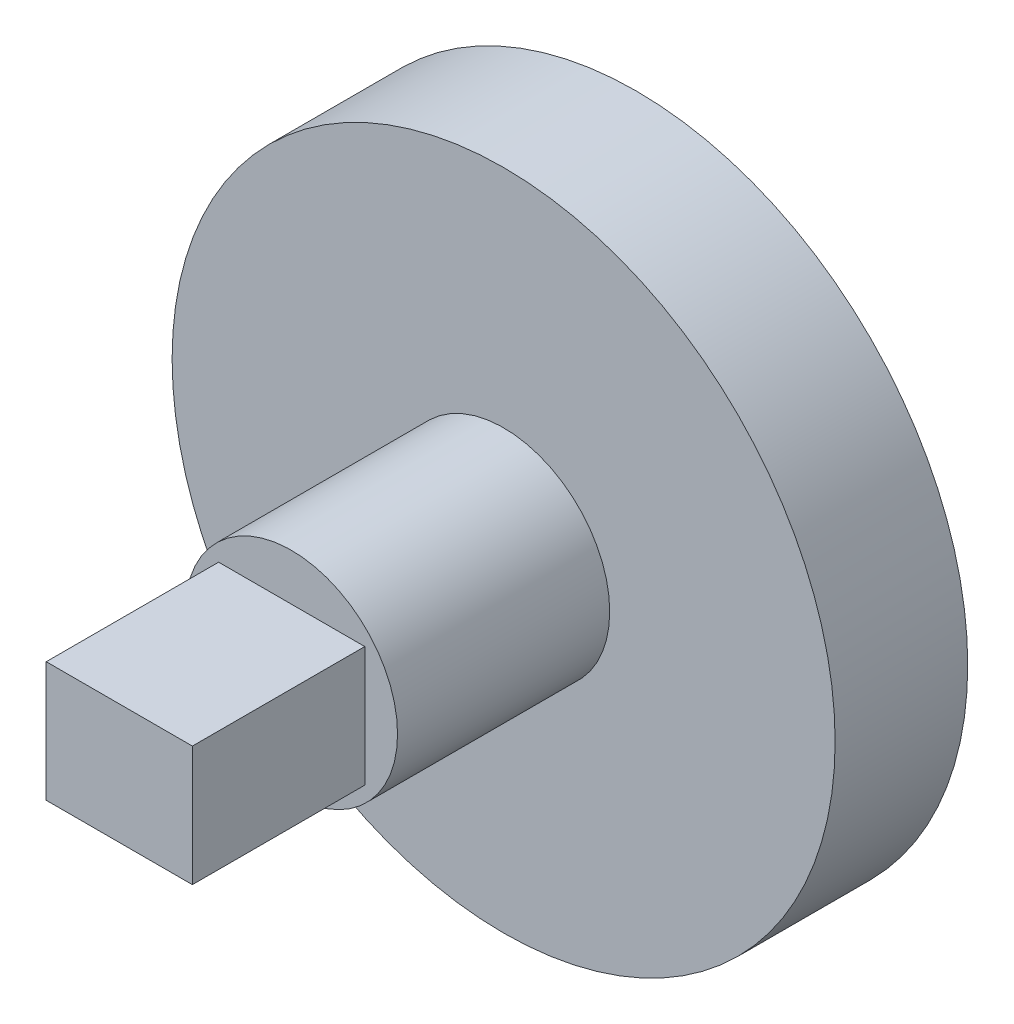
ISO-10303-21;
HEADER;
FILE_DESCRIPTION(('STEP AP214'),'2;1');
FILE_NAME('part.step','',(''),(''),'','','');
FILE_SCHEMA(('AUTOMOTIVE_DESIGN { 1 0 10303 214 1 1 1 1 }'));
ENDSEC;
DATA;
#1=APPLICATION_CONTEXT('core data for automotive mechanical design processes');
#2=APPLICATION_PROTOCOL_DEFINITION('international standard','automotive_design',2000,#1);
#3=PRODUCT_CONTEXT('',#1,'mechanical');
#4=PRODUCT('Part','Part','',(#3));
#5=PRODUCT_RELATED_PRODUCT_CATEGORY('part','',(#4));
#6=PRODUCT_DEFINITION_FORMATION('','',#4);
#7=PRODUCT_DEFINITION_CONTEXT('part definition',#1,'design');
#8=PRODUCT_DEFINITION('design','',#6,#7);
#9=PRODUCT_DEFINITION_SHAPE('','',#8);
#10=(LENGTH_UNIT() NAMED_UNIT(*) SI_UNIT(.MILLI.,.METRE.));
#11=(NAMED_UNIT(*) PLANE_ANGLE_UNIT() SI_UNIT($,.RADIAN.));
#12=(NAMED_UNIT(*) SI_UNIT($,.STERADIAN.) SOLID_ANGLE_UNIT());
#13=UNCERTAINTY_MEASURE_WITH_UNIT(LENGTH_MEASURE(1.E-05),#10,'distance_accuracy_value','');
#14=(GEOMETRIC_REPRESENTATION_CONTEXT(3) GLOBAL_UNCERTAINTY_ASSIGNED_CONTEXT((#13)) GLOBAL_UNIT_ASSIGNED_CONTEXT((#10,
#11,#12)) REPRESENTATION_CONTEXT('',''));
#15=CARTESIAN_POINT('',(0.,0.,0.));
#16=DIRECTION('',(0.,0.,1.));
#17=DIRECTION('',(1.,0.,0.));
#18=AXIS2_PLACEMENT_3D('',#15,#16,#17);
#19=CARTESIAN_POINT('',(0.,0.,5.));
#20=DIRECTION('',(0.,0.,-1.));
#21=DIRECTION('',(-1.,0.,0.));
#22=AXIS2_PLACEMENT_3D('',#19,#20,#21);
#23=CYLINDRICAL_SURFACE('',#22,12.5);
#24=CARTESIAN_POINT('',(0.,0.,5.));
#25=DIRECTION('',(0.,0.,1.));
#26=DIRECTION('',(1.,0.,0.));
#27=AXIS2_PLACEMENT_3D('',#24,#25,#26);
#28=CIRCLE('',#27,12.5);
#29=CARTESIAN_POINT('',(12.5,0.,5.));
#30=VERTEX_POINT('',#29);
#31=EDGE_CURVE('E49',#30,#30,#28,.T.);
#32=ORIENTED_EDGE('',*,*,#31,.F.);
#33=EDGE_LOOP('',(#32));
#34=FACE_BOUND('',#33,.T.);
#35=CARTESIAN_POINT('',(0.,0.,0.));
#36=DIRECTION('',(0.,0.,1.));
#37=DIRECTION('',(1.,0.,0.));
#38=AXIS2_PLACEMENT_3D('',#35,#36,#37);
#39=CIRCLE('',#38,12.5);
#40=CARTESIAN_POINT('',(12.5,0.,0.));
#41=VERTEX_POINT('',#40);
#42=EDGE_CURVE('E44',#41,#41,#39,.T.);
#43=ORIENTED_EDGE('',*,*,#42,.T.);
#44=EDGE_LOOP('',(#43));
#45=FACE_BOUND('',#44,.T.);
#46=ADVANCED_FACE('F41',(#34,#45),#23,.T.);
#47=CARTESIAN_POINT('',(0.,0.,5.));
#48=DIRECTION('',(0.,0.,1.));
#49=DIRECTION('',(1.,0.,0.));
#50=AXIS2_PLACEMENT_3D('',#47,#48,#49);
#51=PLANE('',#50);
#52=CARTESIAN_POINT('',(0.,0.,5.));
#53=DIRECTION('',(0.,0.,1.));
#54=DIRECTION('',(1.,0.,0.));
#55=AXIS2_PLACEMENT_3D('',#52,#53,#54);
#56=CIRCLE('',#55,4.);
#57=CARTESIAN_POINT('',(4.,0.,5.));
#58=VERTEX_POINT('',#57);
#59=EDGE_CURVE('E11',#58,#58,#56,.T.);
#60=ORIENTED_EDGE('',*,*,#59,.F.);
#61=EDGE_LOOP('',(#60));
#62=FACE_BOUND('',#61,.T.);
#63=ORIENTED_EDGE('',*,*,#31,.T.);
#64=EDGE_LOOP('',(#63));
#65=FACE_BOUND('',#64,.T.);
#66=ADVANCED_FACE('F120',(#62,#65),#51,.T.);
#67=CARTESIAN_POINT('',(0.,0.,0.));
#68=DIRECTION('',(0.,0.,1.));
#69=DIRECTION('',(1.,0.,0.));
#70=AXIS2_PLACEMENT_3D('',#67,#68,#69);
#71=PLANE('',#70);
#72=ORIENTED_EDGE('',*,*,#42,.F.);
#73=EDGE_LOOP('',(#72));
#74=FACE_BOUND('',#73,.T.);
#75=ADVANCED_FACE('F117',(#74),#71,.F.);
#76=CARTESIAN_POINT('',(0.,0.,13.));
#77=DIRECTION('',(0.,0.,-1.));
#78=DIRECTION('',(-1.,0.,0.));
#79=AXIS2_PLACEMENT_3D('',#76,#77,#78);
#80=CYLINDRICAL_SURFACE('',#79,4.);
#81=CARTESIAN_POINT('',(0.,0.,13.));
#82=DIRECTION('',(0.,0.,1.));
#83=DIRECTION('',(1.,0.,0.));
#84=AXIS2_PLACEMENT_3D('',#81,#82,#83);
#85=CIRCLE('',#84,4.);
#86=CARTESIAN_POINT('',(4.,0.,13.));
#87=VERTEX_POINT('',#86);
#88=EDGE_CURVE('E103',#87,#87,#85,.T.);
#89=ORIENTED_EDGE('',*,*,#88,.F.);
#90=EDGE_LOOP('',(#89));
#91=FACE_BOUND('',#90,.T.);
#92=ORIENTED_EDGE('',*,*,#59,.T.);
#93=EDGE_LOOP('',(#92));
#94=FACE_BOUND('',#93,.T.);
#95=ADVANCED_FACE('F119',(#91,#94),#80,.T.);
#96=CARTESIAN_POINT('',(0.,0.,13.));
#97=DIRECTION('',(0.,0.,1.));
#98=DIRECTION('',(1.,0.,0.));
#99=AXIS2_PLACEMENT_3D('',#96,#97,#98);
#100=PLANE('',#99);
#101=DIRECTION('',(0.,-1.,0.));
#102=VECTOR('',#101,1.);
#103=CARTESIAN_POINT('',(-2.74571018336308,2.23874083340267,13.));
#104=LINE('',#103,#102);
#105=CARTESIAN_POINT('',(-2.74571018336308,2.23874083340267,13.));
#106=VERTEX_POINT('',#105);
#107=CARTESIAN_POINT('',(-2.74571018336308,-2.28728089989337,13.));
#108=VERTEX_POINT('',#107);
#109=EDGE_CURVE('E57',#106,#108,#104,.T.);
#110=ORIENTED_EDGE('',*,*,#109,.F.);
#111=DIRECTION('',(-1.,0.,0.));
#112=VECTOR('',#111,1.);
#113=CARTESIAN_POINT('',(-2.74571018336308,2.23874083340267,13.));
#114=LINE('',#113,#112);
#115=CARTESIAN_POINT('',(2.76432494682305,2.23874083340267,13.));
#116=VERTEX_POINT('',#115);
#117=EDGE_CURVE('E61',#116,#106,#114,.T.);
#118=ORIENTED_EDGE('',*,*,#117,.F.);
#119=DIRECTION('',(0.,1.,0.));
#120=VECTOR('',#119,1.);
#121=CARTESIAN_POINT('',(2.76432494682305,2.23874083340267,13.));
#122=LINE('',#121,#120);
#123=CARTESIAN_POINT('',(2.76432494682305,-2.28728089989337,13.));
#124=VERTEX_POINT('',#123);
#125=EDGE_CURVE('E209',#124,#116,#122,.T.);
#126=ORIENTED_EDGE('',*,*,#125,.F.);
#127=DIRECTION('',(1.,0.,0.));
#128=VECTOR('',#127,1.);
#129=CARTESIAN_POINT('',(-2.74571018336308,-2.28728089989337,13.));
#130=LINE('',#129,#128);
#131=EDGE_CURVE('E215',#108,#124,#130,.T.);
#132=ORIENTED_EDGE('',*,*,#131,.F.);
#133=EDGE_LOOP('',(#110,#118,#126,#132));
#134=FACE_BOUND('',#133,.T.);
#135=ORIENTED_EDGE('',*,*,#88,.T.);
#136=EDGE_LOOP('',(#135));
#137=FACE_BOUND('',#136,.T.);
#138=ADVANCED_FACE('F126',(#134,#137),#100,.T.);
#139=CARTESIAN_POINT('',(-2.74571018336308,2.23874083340267,19.5));
#140=DIRECTION('',(1.,0.,0.));
#141=DIRECTION('',(0.,0.,-1.));
#142=AXIS2_PLACEMENT_3D('',#139,#140,#141);
#143=PLANE('',#142);
#144=ORIENTED_EDGE('',*,*,#109,.T.);
#145=DIRECTION('',(0.,0.,-1.));
#146=VECTOR('',#145,1.);
#147=CARTESIAN_POINT('',(-2.74571018336308,-2.28728089989337,19.5));
#148=LINE('',#147,#146);
#149=CARTESIAN_POINT('',(-2.74571018336308,-2.28728089989337,19.5));
#150=VERTEX_POINT('',#149);
#151=EDGE_CURVE('E86',#150,#108,#148,.T.);
#152=ORIENTED_EDGE('',*,*,#151,.F.);
#153=DIRECTION('',(0.,-1.,0.));
#154=VECTOR('',#153,1.);
#155=CARTESIAN_POINT('',(-2.74571018336308,2.23874083340267,19.5));
#156=LINE('',#155,#154);
#157=CARTESIAN_POINT('',(-2.74571018336308,2.23874083340267,19.5));
#158=VERTEX_POINT('',#157);
#159=EDGE_CURVE('E92',#158,#150,#156,.T.);
#160=ORIENTED_EDGE('',*,*,#159,.F.);
#161=DIRECTION('',(0.,0.,-1.));
#162=VECTOR('',#161,1.);
#163=CARTESIAN_POINT('',(-2.74571018336308,2.23874083340267,19.5));
#164=LINE('',#163,#162);
#165=EDGE_CURVE('E207',#158,#106,#164,.T.);
#166=ORIENTED_EDGE('',*,*,#165,.T.);
#167=EDGE_LOOP('',(#144,#152,#160,#166));
#168=FACE_BOUND('',#167,.T.);
#169=ADVANCED_FACE('F102',(#168),#143,.F.);
#170=CARTESIAN_POINT('',(-2.74571018336308,-2.28728089989337,19.5));
#171=DIRECTION('',(0.,1.,0.));
#172=DIRECTION('',(0.,0.,1.));
#173=AXIS2_PLACEMENT_3D('',#170,#171,#172);
#174=PLANE('',#173);
#175=ORIENTED_EDGE('',*,*,#131,.T.);
#176=DIRECTION('',(0.,0.,-1.));
#177=VECTOR('',#176,1.);
#178=CARTESIAN_POINT('',(2.76432494682305,-2.28728089989337,19.5));
#179=LINE('',#178,#177);
#180=CARTESIAN_POINT('',(2.76432494682305,-2.28728089989337,19.5));
#181=VERTEX_POINT('',#180);
#182=EDGE_CURVE('E88',#181,#124,#179,.T.);
#183=ORIENTED_EDGE('',*,*,#182,.F.);
#184=DIRECTION('',(1.,0.,0.));
#185=VECTOR('',#184,1.);
#186=CARTESIAN_POINT('',(-2.74571018336308,-2.28728089989337,19.5));
#187=LINE('',#186,#185);
#188=EDGE_CURVE('E81',#150,#181,#187,.T.);
#189=ORIENTED_EDGE('',*,*,#188,.F.);
#190=ORIENTED_EDGE('',*,*,#151,.T.);
#191=EDGE_LOOP('',(#175,#183,#189,#190));
#192=FACE_BOUND('',#191,.T.);
#193=ADVANCED_FACE('F84',(#192),#174,.F.);
#194=CARTESIAN_POINT('',(2.76432494682305,2.23874083340267,19.5));
#195=DIRECTION('',(-1.,0.,0.));
#196=DIRECTION('',(0.,0.,1.));
#197=AXIS2_PLACEMENT_3D('',#194,#195,#196);
#198=PLANE('',#197);
#199=ORIENTED_EDGE('',*,*,#125,.T.);
#200=DIRECTION('',(0.,0.,-1.));
#201=VECTOR('',#200,1.);
#202=CARTESIAN_POINT('',(2.76432494682305,2.23874083340267,19.5));
#203=LINE('',#202,#201);
#204=CARTESIAN_POINT('',(2.76432494682305,2.23874083340267,19.5));
#205=VERTEX_POINT('',#204);
#206=EDGE_CURVE('E107',#205,#116,#203,.T.);
#207=ORIENTED_EDGE('',*,*,#206,.F.);
#208=DIRECTION('',(0.,1.,0.));
#209=VECTOR('',#208,1.);
#210=CARTESIAN_POINT('',(2.76432494682305,2.23874083340267,19.5));
#211=LINE('',#210,#209);
#212=EDGE_CURVE('E91',#181,#205,#211,.T.);
#213=ORIENTED_EDGE('',*,*,#212,.F.);
#214=ORIENTED_EDGE('',*,*,#182,.T.);
#215=EDGE_LOOP('',(#199,#207,#213,#214));
#216=FACE_BOUND('',#215,.T.);
#217=ADVANCED_FACE('F176',(#216),#198,.F.);
#218=CARTESIAN_POINT('',(-2.74571018336308,2.23874083340267,19.5));
#219=DIRECTION('',(0.,-1.,0.));
#220=DIRECTION('',(0.,0.,-1.));
#221=AXIS2_PLACEMENT_3D('',#218,#219,#220);
#222=PLANE('',#221);
#223=ORIENTED_EDGE('',*,*,#117,.T.);
#224=ORIENTED_EDGE('',*,*,#165,.F.);
#225=DIRECTION('',(-1.,0.,0.));
#226=VECTOR('',#225,1.);
#227=CARTESIAN_POINT('',(-2.74571018336308,2.23874083340267,19.5));
#228=LINE('',#227,#226);
#229=EDGE_CURVE('E97',#205,#158,#228,.T.);
#230=ORIENTED_EDGE('',*,*,#229,.F.);
#231=ORIENTED_EDGE('',*,*,#206,.T.);
#232=EDGE_LOOP('',(#223,#224,#230,#231));
#233=FACE_BOUND('',#232,.T.);
#234=ADVANCED_FACE('F185',(#233),#222,.F.);
#235=CARTESIAN_POINT('',(0.,0.,19.5));
#236=DIRECTION('',(0.,0.,1.));
#237=DIRECTION('',(1.,0.,0.));
#238=AXIS2_PLACEMENT_3D('',#235,#236,#237);
#239=PLANE('',#238);
#240=ORIENTED_EDGE('',*,*,#159,.T.);
#241=ORIENTED_EDGE('',*,*,#188,.T.);
#242=ORIENTED_EDGE('',*,*,#212,.T.);
#243=ORIENTED_EDGE('',*,*,#229,.T.);
#244=EDGE_LOOP('',(#240,#241,#242,#243));
#245=FACE_BOUND('',#244,.T.);
#246=ADVANCED_FACE('F95',(#245),#239,.T.);
#247=CLOSED_SHELL('',(#46,#66,#75,#95,#138,#169,#193,#217,#234,#246));
#248=MANIFOLD_SOLID_BREP('B2',#247);
#249=ADVANCED_BREP_SHAPE_REPRESENTATION('',(#18,#248),#14);
#250=SHAPE_DEFINITION_REPRESENTATION(#9,#249);
ENDSEC;
END-ISO-10303-21;
